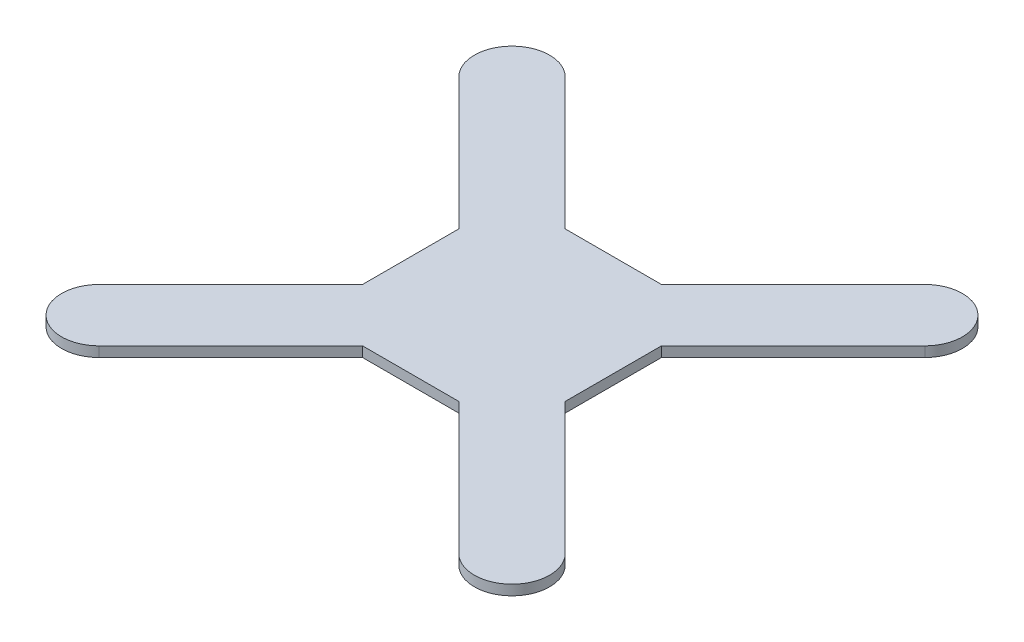
ISO-10303-21;
HEADER;
FILE_DESCRIPTION(('STEP AP214'),'2;1');
FILE_NAME('part.step','',(''),(''),'','','');
FILE_SCHEMA(('AUTOMOTIVE_DESIGN { 1 0 10303 214 1 1 1 1 }'));
ENDSEC;
DATA;
#1=APPLICATION_CONTEXT('core data for automotive mechanical design processes');
#2=APPLICATION_PROTOCOL_DEFINITION('international standard','automotive_design',2000,#1);
#3=PRODUCT_CONTEXT('',#1,'mechanical');
#4=PRODUCT('Part','Part','',(#3));
#5=PRODUCT_RELATED_PRODUCT_CATEGORY('part','',(#4));
#6=PRODUCT_DEFINITION_FORMATION('','',#4);
#7=PRODUCT_DEFINITION_CONTEXT('part definition',#1,'design');
#8=PRODUCT_DEFINITION('design','',#6,#7);
#9=PRODUCT_DEFINITION_SHAPE('','',#8);
#10=(LENGTH_UNIT() NAMED_UNIT(*) SI_UNIT(.MILLI.,.METRE.));
#11=(NAMED_UNIT(*) PLANE_ANGLE_UNIT() SI_UNIT($,.RADIAN.));
#12=(NAMED_UNIT(*) SI_UNIT($,.STERADIAN.) SOLID_ANGLE_UNIT());
#13=UNCERTAINTY_MEASURE_WITH_UNIT(LENGTH_MEASURE(1.E-05),#10,'distance_accuracy_value','');
#14=(GEOMETRIC_REPRESENTATION_CONTEXT(3) GLOBAL_UNCERTAINTY_ASSIGNED_CONTEXT((#13)) GLOBAL_UNIT_ASSIGNED_CONTEXT((#10,
#11,#12)) REPRESENTATION_CONTEXT('',''));
#15=CARTESIAN_POINT('',(0.,0.,0.));
#16=DIRECTION('',(0.,0.,1.));
#17=DIRECTION('',(1.,0.,0.));
#18=AXIS2_PLACEMENT_3D('',#15,#16,#17);
#19=CARTESIAN_POINT('',(330.,10.,0.));
#20=DIRECTION('',(1.,0.,0.));
#21=DIRECTION('',(0.,0.,-1.));
#22=AXIS2_PLACEMENT_3D('',#19,#20,#21);
#23=PLANE('',#22);
#24=DIRECTION('',(0.,0.,1.));
#25=VECTOR('',#24,1.);
#26=CARTESIAN_POINT('',(330.,0.,0.));
#27=LINE('',#26,#25);
#28=CARTESIAN_POINT('',(330.,0.,182.5));
#29=VERTEX_POINT('',#28);
#30=CARTESIAN_POINT('',(330.,0.,277.5));
#31=VERTEX_POINT('',#30);
#32=EDGE_CURVE('E178',#29,#31,#27,.T.);
#33=ORIENTED_EDGE('',*,*,#32,.F.);
#34=DIRECTION('',(0.,-1.,0.));
#35=VECTOR('',#34,1.);
#36=CARTESIAN_POINT('',(330.,10.,182.5));
#37=LINE('',#36,#35);
#38=CARTESIAN_POINT('',(330.,10.,182.5));
#39=VERTEX_POINT('',#38);
#40=EDGE_CURVE('E11',#39,#29,#37,.T.);
#41=ORIENTED_EDGE('',*,*,#40,.F.);
#42=DIRECTION('',(0.,0.,1.));
#43=VECTOR('',#42,1.);
#44=CARTESIAN_POINT('',(330.,10.,0.));
#45=LINE('',#44,#43);
#46=CARTESIAN_POINT('',(330.,10.,277.5));
#47=VERTEX_POINT('',#46);
#48=EDGE_CURVE('E217',#39,#47,#45,.T.);
#49=ORIENTED_EDGE('',*,*,#48,.T.);
#50=DIRECTION('',(0.,-1.,0.));
#51=VECTOR('',#50,1.);
#52=CARTESIAN_POINT('',(330.,10.,277.5));
#53=LINE('',#52,#51);
#54=EDGE_CURVE('E51',#47,#31,#53,.T.);
#55=ORIENTED_EDGE('',*,*,#54,.T.);
#56=EDGE_LOOP('',(#33,#41,#49,#55));
#57=FACE_BOUND('',#56,.T.);
#58=ADVANCED_FACE('F35',(#57),#23,.T.);
#59=CARTESIAN_POINT('',(256.250000000003,10.,256.249999999999));
#60=DIRECTION('',(-0.707106781186553,0.,-0.707106781186542));
#61=DIRECTION('',(-0.707106781186542,0.,0.707106781186553));
#62=AXIS2_PLACEMENT_3D('',#59,#60,#61);
#63=PLANE('',#62);
#64=DIRECTION('',(0.707106781186542,0.,-0.707106781186553));
#65=VECTOR('',#64,1.);
#66=CARTESIAN_POINT('',(256.250000000003,0.,256.249999999999));
#67=LINE('',#66,#65);
#68=CARTESIAN_POINT('',(459.999999999999,0.,52.4999999999988));
#69=VERTEX_POINT('',#68);
#70=EDGE_CURVE('E180',#29,#69,#67,.T.);
#71=ORIENTED_EDGE('',*,*,#70,.T.);
#72=DIRECTION('',(0.,-1.,0.));
#73=VECTOR('',#72,1.);
#74=CARTESIAN_POINT('',(459.999999999999,10.,52.4999999999988));
#75=LINE('',#74,#73);
#76=CARTESIAN_POINT('',(459.999999999999,10.,52.4999999999988));
#77=VERTEX_POINT('',#76);
#78=EDGE_CURVE('E43',#77,#69,#75,.T.);
#79=ORIENTED_EDGE('',*,*,#78,.F.);
#80=DIRECTION('',(0.707106781186542,0.,-0.707106781186553));
#81=VECTOR('',#80,1.);
#82=CARTESIAN_POINT('',(256.250000000003,10.,256.249999999999));
#83=LINE('',#82,#81);
#84=EDGE_CURVE('E269',#39,#77,#83,.T.);
#85=ORIENTED_EDGE('',*,*,#84,.F.);
#86=ORIENTED_EDGE('',*,*,#40,.T.);
#87=EDGE_LOOP('',(#71,#79,#85,#86));
#88=FACE_BOUND('',#87,.T.);
#89=ADVANCED_FACE('F310',(#88),#63,.F.);
#90=CARTESIAN_POINT('',(433.75,10.,26.2499999999991));
#91=DIRECTION('',(0.,-1.,0.));
#92=DIRECTION('',(0.,0.,-1.));
#93=AXIS2_PLACEMENT_3D('',#90,#91,#92);
#94=CYLINDRICAL_SURFACE('',#93,37.1231060122933);
#95=CARTESIAN_POINT('',(433.75,0.,26.2499999999991));
#96=DIRECTION('',(0.,1.,0.));
#97=DIRECTION('',(0.,0.,1.));
#98=AXIS2_PLACEMENT_3D('',#95,#96,#97);
#99=CIRCLE('',#98,37.1231060122933);
#100=CARTESIAN_POINT('',(407.5,0.,-3.33066907387547E-13));
#101=VERTEX_POINT('',#100);
#102=EDGE_CURVE('E182',#69,#101,#99,.T.);
#103=ORIENTED_EDGE('',*,*,#102,.T.);
#104=DIRECTION('',(0.,-1.,0.));
#105=VECTOR('',#104,1.);
#106=CARTESIAN_POINT('',(407.5,10.,-3.33066907387547E-13));
#107=LINE('',#106,#105);
#108=CARTESIAN_POINT('',(407.5,10.,-3.33066907387547E-13));
#109=VERTEX_POINT('',#108);
#110=EDGE_CURVE('E242',#109,#101,#107,.T.);
#111=ORIENTED_EDGE('',*,*,#110,.F.);
#112=CARTESIAN_POINT('',(433.75,10.,26.2499999999991));
#113=DIRECTION('',(0.,1.,0.));
#114=DIRECTION('',(0.,0.,1.));
#115=AXIS2_PLACEMENT_3D('',#112,#113,#114);
#116=CIRCLE('',#115,37.1231060122933);
#117=EDGE_CURVE('E250',#77,#109,#116,.T.);
#118=ORIENTED_EDGE('',*,*,#117,.F.);
#119=ORIENTED_EDGE('',*,*,#78,.T.);
#120=EDGE_LOOP('',(#103,#111,#118,#119));
#121=FACE_BOUND('',#120,.T.);
#122=ADVANCED_FACE('F248',(#121),#94,.T.);
#123=CARTESIAN_POINT('',(203.750000000001,10.,203.75));
#124=DIRECTION('',(-0.707106781186549,0.,-0.707106781186546));
#125=DIRECTION('',(-0.707106781186546,0.,0.707106781186549));
#126=AXIS2_PLACEMENT_3D('',#123,#124,#125);
#127=PLANE('',#126);
#128=DIRECTION('',(0.707106781186546,0.,-0.707106781186549));
#129=VECTOR('',#128,1.);
#130=CARTESIAN_POINT('',(203.750000000001,0.,203.75));
#131=LINE('',#130,#129);
#132=CARTESIAN_POINT('',(277.5,0.,130.));
#133=VERTEX_POINT('',#132);
#134=EDGE_CURVE('E185',#133,#101,#131,.T.);
#135=ORIENTED_EDGE('',*,*,#134,.F.);
#136=DIRECTION('',(0.,-1.,0.));
#137=VECTOR('',#136,1.);
#138=CARTESIAN_POINT('',(277.5,10.,130.));
#139=LINE('',#138,#137);
#140=CARTESIAN_POINT('',(277.5,10.,130.));
#141=VERTEX_POINT('',#140);
#142=EDGE_CURVE('E240',#141,#133,#139,.T.);
#143=ORIENTED_EDGE('',*,*,#142,.F.);
#144=DIRECTION('',(0.707106781186546,0.,-0.707106781186549));
#145=VECTOR('',#144,1.);
#146=CARTESIAN_POINT('',(203.750000000001,10.,203.75));
#147=LINE('',#146,#145);
#148=EDGE_CURVE('E262',#141,#109,#147,.T.);
#149=ORIENTED_EDGE('',*,*,#148,.T.);
#150=ORIENTED_EDGE('',*,*,#110,.T.);
#151=EDGE_LOOP('',(#135,#143,#149,#150));
#152=FACE_BOUND('',#151,.T.);
#153=ADVANCED_FACE('F259',(#152),#127,.T.);
#154=CARTESIAN_POINT('',(0.,10.,130.));
#155=DIRECTION('',(0.,0.,-1.));
#156=DIRECTION('',(-1.,0.,0.));
#157=AXIS2_PLACEMENT_3D('',#154,#155,#156);
#158=PLANE('',#157);
#159=DIRECTION('',(1.,0.,0.));
#160=VECTOR('',#159,1.);
#161=CARTESIAN_POINT('',(0.,0.,130.));
#162=LINE('',#161,#160);
#163=CARTESIAN_POINT('',(182.5,0.,130.));
#164=VERTEX_POINT('',#163);
#165=EDGE_CURVE('E188',#164,#133,#162,.T.);
#166=ORIENTED_EDGE('',*,*,#165,.F.);
#167=DIRECTION('',(0.,-1.,0.));
#168=VECTOR('',#167,1.);
#169=CARTESIAN_POINT('',(182.5,10.,130.));
#170=LINE('',#169,#168);
#171=CARTESIAN_POINT('',(182.5,10.,130.));
#172=VERTEX_POINT('',#171);
#173=EDGE_CURVE('E238',#172,#164,#170,.T.);
#174=ORIENTED_EDGE('',*,*,#173,.F.);
#175=DIRECTION('',(1.,0.,0.));
#176=VECTOR('',#175,1.);
#177=CARTESIAN_POINT('',(0.,10.,130.));
#178=LINE('',#177,#176);
#179=EDGE_CURVE('E265',#172,#141,#178,.T.);
#180=ORIENTED_EDGE('',*,*,#179,.T.);
#181=ORIENTED_EDGE('',*,*,#142,.T.);
#182=EDGE_LOOP('',(#166,#174,#180,#181));
#183=FACE_BOUND('',#182,.T.);
#184=ADVANCED_FACE('F422',(#183),#158,.T.);
#185=CARTESIAN_POINT('',(26.2500000000004,10.,-26.2500000000003));
#186=DIRECTION('',(-0.707106781186549,0.,0.707106781186546));
#187=DIRECTION('',(0.707106781186546,0.,0.707106781186549));
#188=AXIS2_PLACEMENT_3D('',#185,#186,#187);
#189=PLANE('',#188);
#190=DIRECTION('',(-0.707106781186546,0.,-0.707106781186549));
#191=VECTOR('',#190,1.);
#192=CARTESIAN_POINT('',(26.2500000000004,0.,-26.2500000000003));
#193=LINE('',#192,#191);
#194=CARTESIAN_POINT('',(52.5000000000005,0.,0.));
#195=VERTEX_POINT('',#194);
#196=EDGE_CURVE('E191',#164,#195,#193,.T.);
#197=ORIENTED_EDGE('',*,*,#196,.T.);
#198=DIRECTION('',(0.,-1.,0.));
#199=VECTOR('',#198,1.);
#200=CARTESIAN_POINT('',(52.5000000000005,10.,0.));
#201=LINE('',#200,#199);
#202=CARTESIAN_POINT('',(52.5000000000005,10.,0.));
#203=VERTEX_POINT('',#202);
#204=EDGE_CURVE('E235',#203,#195,#201,.T.);
#205=ORIENTED_EDGE('',*,*,#204,.F.);
#206=DIRECTION('',(-0.707106781186546,0.,-0.707106781186549));
#207=VECTOR('',#206,1.);
#208=CARTESIAN_POINT('',(26.2500000000004,10.,-26.2500000000003));
#209=LINE('',#208,#207);
#210=EDGE_CURVE('E267',#172,#203,#209,.T.);
#211=ORIENTED_EDGE('',*,*,#210,.F.);
#212=ORIENTED_EDGE('',*,*,#173,.T.);
#213=EDGE_LOOP('',(#197,#205,#211,#212));
#214=FACE_BOUND('',#213,.T.);
#215=ADVANCED_FACE('F412',(#214),#189,.F.);
#216=CARTESIAN_POINT('',(26.2500000000003,10.,26.2499999999993));
#217=DIRECTION('',(0.,-1.,0.));
#218=DIRECTION('',(0.,0.,-1.));
#219=AXIS2_PLACEMENT_3D('',#216,#217,#218);
#220=CYLINDRICAL_SURFACE('',#219,37.1231060122935);
#221=CARTESIAN_POINT('',(26.2500000000003,0.,26.2499999999993));
#222=DIRECTION('',(0.,1.,0.));
#223=DIRECTION('',(0.,0.,1.));
#224=AXIS2_PLACEMENT_3D('',#221,#222,#223);
#225=CIRCLE('',#224,37.1231060122935);
#226=CARTESIAN_POINT('',(0.,0.,52.4999999999986));
#227=VERTEX_POINT('',#226);
#228=EDGE_CURVE('E193',#195,#227,#225,.T.);
#229=ORIENTED_EDGE('',*,*,#228,.T.);
#230=DIRECTION('',(0.,-1.,0.));
#231=VECTOR('',#230,1.);
#232=CARTESIAN_POINT('',(0.,10.,52.4999999999986));
#233=LINE('',#232,#231);
#234=CARTESIAN_POINT('',(0.,10.,52.4999999999986));
#235=VERTEX_POINT('',#234);
#236=EDGE_CURVE('E233',#235,#227,#233,.T.);
#237=ORIENTED_EDGE('',*,*,#236,.F.);
#238=CARTESIAN_POINT('',(26.2500000000003,10.,26.2499999999993));
#239=DIRECTION('',(0.,1.,0.));
#240=DIRECTION('',(0.,0.,1.));
#241=AXIS2_PLACEMENT_3D('',#238,#239,#240);
#242=CIRCLE('',#241,37.1231060122935);
#243=EDGE_CURVE('E274',#203,#235,#242,.T.);
#244=ORIENTED_EDGE('',*,*,#243,.F.);
#245=ORIENTED_EDGE('',*,*,#204,.T.);
#246=EDGE_LOOP('',(#229,#237,#244,#245));
#247=FACE_BOUND('',#246,.T.);
#248=ADVANCED_FACE('F401',(#247),#220,.T.);
#249=CARTESIAN_POINT('',(-26.2499999999993,10.,26.249999999999));
#250=DIRECTION('',(-0.707106781186551,0.,0.707106781186544));
#251=DIRECTION('',(0.707106781186544,0.,0.707106781186551));
#252=AXIS2_PLACEMENT_3D('',#249,#250,#251);
#253=PLANE('',#252);
#254=DIRECTION('',(-0.707106781186544,0.,-0.707106781186551));
#255=VECTOR('',#254,1.);
#256=CARTESIAN_POINT('',(-26.2499999999993,0.,26.249999999999));
#257=LINE('',#256,#255);
#258=CARTESIAN_POINT('',(130.,0.,182.5));
#259=VERTEX_POINT('',#258);
#260=EDGE_CURVE('E196',#259,#227,#257,.T.);
#261=ORIENTED_EDGE('',*,*,#260,.F.);
#262=DIRECTION('',(0.,-1.,0.));
#263=VECTOR('',#262,1.);
#264=CARTESIAN_POINT('',(130.,10.,182.5));
#265=LINE('',#264,#263);
#266=CARTESIAN_POINT('',(130.,10.,182.5));
#267=VERTEX_POINT('',#266);
#268=EDGE_CURVE('E231',#267,#259,#265,.T.);
#269=ORIENTED_EDGE('',*,*,#268,.F.);
#270=DIRECTION('',(-0.707106781186544,0.,-0.707106781186551));
#271=VECTOR('',#270,1.);
#272=CARTESIAN_POINT('',(-26.2499999999993,10.,26.249999999999));
#273=LINE('',#272,#271);
#274=EDGE_CURVE('E276',#267,#235,#273,.T.);
#275=ORIENTED_EDGE('',*,*,#274,.T.);
#276=ORIENTED_EDGE('',*,*,#236,.T.);
#277=EDGE_LOOP('',(#261,#269,#275,#276));
#278=FACE_BOUND('',#277,.T.);
#279=ADVANCED_FACE('F390',(#278),#253,.T.);
#280=CARTESIAN_POINT('',(130.,10.,0.));
#281=DIRECTION('',(1.,0.,0.));
#282=DIRECTION('',(0.,0.,-1.));
#283=AXIS2_PLACEMENT_3D('',#280,#281,#282);
#284=PLANE('',#283);
#285=DIRECTION('',(0.,0.,1.));
#286=VECTOR('',#285,1.);
#287=CARTESIAN_POINT('',(130.,0.,0.));
#288=LINE('',#287,#286);
#289=CARTESIAN_POINT('',(130.,0.,277.5));
#290=VERTEX_POINT('',#289);
#291=EDGE_CURVE('E199',#259,#290,#288,.T.);
#292=ORIENTED_EDGE('',*,*,#291,.T.);
#293=DIRECTION('',(0.,-1.,0.));
#294=VECTOR('',#293,1.);
#295=CARTESIAN_POINT('',(130.,10.,277.5));
#296=LINE('',#295,#294);
#297=CARTESIAN_POINT('',(130.,10.,277.5));
#298=VERTEX_POINT('',#297);
#299=EDGE_CURVE('E228',#298,#290,#296,.T.);
#300=ORIENTED_EDGE('',*,*,#299,.F.);
#301=DIRECTION('',(0.,0.,1.));
#302=VECTOR('',#301,1.);
#303=CARTESIAN_POINT('',(130.,10.,0.));
#304=LINE('',#303,#302);
#305=EDGE_CURVE('E279',#267,#298,#304,.T.);
#306=ORIENTED_EDGE('',*,*,#305,.F.);
#307=ORIENTED_EDGE('',*,*,#268,.T.);
#308=EDGE_LOOP('',(#292,#300,#306,#307));
#309=FACE_BOUND('',#308,.T.);
#310=ADVANCED_FACE('F380',(#309),#284,.F.);
#311=CARTESIAN_POINT('',(203.750000000001,10.,203.749999999999));
#312=DIRECTION('',(0.707106781186551,0.,0.707106781186544));
#313=DIRECTION('',(0.707106781186544,0.,-0.707106781186551));
#314=AXIS2_PLACEMENT_3D('',#311,#312,#313);
#315=PLANE('',#314);
#316=DIRECTION('',(-0.707106781186544,0.,0.707106781186551));
#317=VECTOR('',#316,1.);
#318=CARTESIAN_POINT('',(203.750000000001,0.,203.749999999999));
#319=LINE('',#318,#317);
#320=CARTESIAN_POINT('',(1.11022302462516E-13,0.,407.500000000001));
#321=VERTEX_POINT('',#320);
#322=EDGE_CURVE('E201',#290,#321,#319,.T.);
#323=ORIENTED_EDGE('',*,*,#322,.T.);
#324=DIRECTION('',(0.,-1.,0.));
#325=VECTOR('',#324,1.);
#326=CARTESIAN_POINT('',(1.11022302462516E-13,10.,407.500000000001));
#327=LINE('',#326,#325);
#328=CARTESIAN_POINT('',(1.11022302462516E-13,10.,407.500000000001));
#329=VERTEX_POINT('',#328);
#330=EDGE_CURVE('E225',#329,#321,#327,.T.);
#331=ORIENTED_EDGE('',*,*,#330,.F.);
#332=DIRECTION('',(-0.707106781186544,0.,0.707106781186551));
#333=VECTOR('',#332,1.);
#334=CARTESIAN_POINT('',(203.750000000001,10.,203.749999999999));
#335=LINE('',#334,#333);
#336=EDGE_CURVE('E281',#298,#329,#335,.T.);
#337=ORIENTED_EDGE('',*,*,#336,.F.);
#338=ORIENTED_EDGE('',*,*,#299,.T.);
#339=EDGE_LOOP('',(#323,#331,#337,#338));
#340=FACE_BOUND('',#339,.T.);
#341=ADVANCED_FACE('F371',(#340),#315,.F.);
#342=CARTESIAN_POINT('',(26.2500000000003,10.,433.750000000001));
#343=DIRECTION('',(0.,-1.,0.));
#344=DIRECTION('',(0.,0.,-1.));
#345=AXIS2_PLACEMENT_3D('',#342,#343,#344);
#346=CYLINDRICAL_SURFACE('',#345,37.1231060122935);
#347=CARTESIAN_POINT('',(26.2500000000003,0.,433.750000000001));
#348=DIRECTION('',(0.,1.,0.));
#349=DIRECTION('',(0.,0.,1.));
#350=AXIS2_PLACEMENT_3D('',#347,#348,#349);
#351=CIRCLE('',#350,37.1231060122935);
#352=CARTESIAN_POINT('',(52.5000000000007,0.,460.));
#353=VERTEX_POINT('',#352);
#354=EDGE_CURVE('E203',#321,#353,#351,.T.);
#355=ORIENTED_EDGE('',*,*,#354,.T.);
#356=DIRECTION('',(0.,-1.,0.));
#357=VECTOR('',#356,1.);
#358=CARTESIAN_POINT('',(52.5000000000007,10.,460.));
#359=LINE('',#358,#357);
#360=CARTESIAN_POINT('',(52.5000000000007,10.,460.));
#361=VERTEX_POINT('',#360);
#362=EDGE_CURVE('E223',#361,#353,#359,.T.);
#363=ORIENTED_EDGE('',*,*,#362,.F.);
#364=CARTESIAN_POINT('',(26.2500000000003,10.,433.750000000001));
#365=DIRECTION('',(0.,1.,0.));
#366=DIRECTION('',(0.,0.,1.));
#367=AXIS2_PLACEMENT_3D('',#364,#365,#366);
#368=CIRCLE('',#367,37.1231060122935);
#369=EDGE_CURVE('E283',#329,#361,#368,.T.);
#370=ORIENTED_EDGE('',*,*,#369,.F.);
#371=ORIENTED_EDGE('',*,*,#330,.T.);
#372=EDGE_LOOP('',(#355,#363,#370,#371));
#373=FACE_BOUND('',#372,.T.);
#374=ADVANCED_FACE('F295',(#373),#346,.T.);
#375=CARTESIAN_POINT('',(256.25,10.,256.249999999999));
#376=DIRECTION('',(0.707106781186549,0.,0.707106781186546));
#377=DIRECTION('',(0.707106781186546,0.,-0.707106781186549));
#378=AXIS2_PLACEMENT_3D('',#375,#376,#377);
#379=PLANE('',#378);
#380=DIRECTION('',(-0.707106781186546,0.,0.707106781186549));
#381=VECTOR('',#380,1.);
#382=CARTESIAN_POINT('',(256.25,0.,256.249999999999));
#383=LINE('',#382,#381);
#384=CARTESIAN_POINT('',(182.5,0.,330.));
#385=VERTEX_POINT('',#384);
#386=EDGE_CURVE('E206',#385,#353,#383,.T.);
#387=ORIENTED_EDGE('',*,*,#386,.F.);
#388=DIRECTION('',(0.,-1.,0.));
#389=VECTOR('',#388,1.);
#390=CARTESIAN_POINT('',(182.5,10.,330.));
#391=LINE('',#390,#389);
#392=CARTESIAN_POINT('',(182.5,10.,330.));
#393=VERTEX_POINT('',#392);
#394=EDGE_CURVE('E221',#393,#385,#391,.T.);
#395=ORIENTED_EDGE('',*,*,#394,.F.);
#396=DIRECTION('',(-0.707106781186546,0.,0.707106781186549));
#397=VECTOR('',#396,1.);
#398=CARTESIAN_POINT('',(256.25,10.,256.249999999999));
#399=LINE('',#398,#397);
#400=EDGE_CURVE('E285',#393,#361,#399,.T.);
#401=ORIENTED_EDGE('',*,*,#400,.T.);
#402=ORIENTED_EDGE('',*,*,#362,.T.);
#403=EDGE_LOOP('',(#387,#395,#401,#402));
#404=FACE_BOUND('',#403,.T.);
#405=ADVANCED_FACE('F289',(#404),#379,.T.);
#406=CARTESIAN_POINT('',(0.,10.,330.));
#407=DIRECTION('',(0.,0.,-1.));
#408=DIRECTION('',(-1.,0.,0.));
#409=AXIS2_PLACEMENT_3D('',#406,#407,#408);
#410=PLANE('',#409);
#411=DIRECTION('',(1.,0.,0.));
#412=VECTOR('',#411,1.);
#413=CARTESIAN_POINT('',(0.,0.,330.));
#414=LINE('',#413,#412);
#415=CARTESIAN_POINT('',(277.5,0.,330.));
#416=VERTEX_POINT('',#415);
#417=EDGE_CURVE('E209',#385,#416,#414,.T.);
#418=ORIENTED_EDGE('',*,*,#417,.T.);
#419=DIRECTION('',(0.,-1.,0.));
#420=VECTOR('',#419,1.);
#421=CARTESIAN_POINT('',(277.5,10.,330.));
#422=LINE('',#421,#420);
#423=CARTESIAN_POINT('',(277.5,10.,330.));
#424=VERTEX_POINT('',#423);
#425=EDGE_CURVE('E170',#424,#416,#422,.T.);
#426=ORIENTED_EDGE('',*,*,#425,.F.);
#427=DIRECTION('',(1.,0.,0.));
#428=VECTOR('',#427,1.);
#429=CARTESIAN_POINT('',(0.,10.,330.));
#430=LINE('',#429,#428);
#431=EDGE_CURVE('E158',#393,#424,#430,.T.);
#432=ORIENTED_EDGE('',*,*,#431,.F.);
#433=ORIENTED_EDGE('',*,*,#394,.T.);
#434=EDGE_LOOP('',(#418,#426,#432,#433));
#435=FACE_BOUND('',#434,.T.);
#436=ADVANCED_FACE('F300',(#435),#410,.F.);
#437=CARTESIAN_POINT('',(-26.2499999999994,10.,26.2499999999993));
#438=DIRECTION('',(0.707106781186549,0.,-0.707106781186546));
#439=DIRECTION('',(-0.707106781186546,0.,-0.707106781186549));
#440=AXIS2_PLACEMENT_3D('',#437,#438,#439);
#441=PLANE('',#440);
#442=DIRECTION('',(0.707106781186546,0.,0.707106781186549));
#443=VECTOR('',#442,1.);
#444=CARTESIAN_POINT('',(-26.2499999999994,0.,26.2499999999993));
#445=LINE('',#444,#443);
#446=CARTESIAN_POINT('',(407.499999999999,0.,460.));
#447=VERTEX_POINT('',#446);
#448=EDGE_CURVE('E167',#416,#447,#445,.T.);
#449=ORIENTED_EDGE('',*,*,#448,.T.);
#450=DIRECTION('',(0.,-1.,0.));
#451=VECTOR('',#450,1.);
#452=CARTESIAN_POINT('',(407.499999999999,10.,460.));
#453=LINE('',#452,#451);
#454=CARTESIAN_POINT('',(407.499999999999,10.,460.));
#455=VERTEX_POINT('',#454);
#456=EDGE_CURVE('E164',#455,#447,#453,.T.);
#457=ORIENTED_EDGE('',*,*,#456,.F.);
#458=DIRECTION('',(0.707106781186546,0.,0.707106781186549));
#459=VECTOR('',#458,1.);
#460=CARTESIAN_POINT('',(-26.2499999999994,10.,26.2499999999993));
#461=LINE('',#460,#459);
#462=EDGE_CURVE('E149',#424,#455,#461,.T.);
#463=ORIENTED_EDGE('',*,*,#462,.F.);
#464=ORIENTED_EDGE('',*,*,#425,.T.);
#465=EDGE_LOOP('',(#449,#457,#463,#464));
#466=FACE_BOUND('',#465,.T.);
#467=ADVANCED_FACE('F165',(#466),#441,.F.);
#468=CARTESIAN_POINT('',(433.75,10.,433.750000000001));
#469=DIRECTION('',(0.,-1.,0.));
#470=DIRECTION('',(0.,0.,-1.));
#471=AXIS2_PLACEMENT_3D('',#468,#469,#470);
#472=CYLINDRICAL_SURFACE('',#471,37.1231060122935);
#473=CARTESIAN_POINT('',(433.75,0.,433.750000000001));
#474=DIRECTION('',(0.,1.,0.));
#475=DIRECTION('',(0.,0.,1.));
#476=AXIS2_PLACEMENT_3D('',#473,#474,#475);
#477=CIRCLE('',#476,37.1231060122935);
#478=CARTESIAN_POINT('',(460.,0.,407.500000000001));
#479=VERTEX_POINT('',#478);
#480=EDGE_CURVE('E212',#447,#479,#477,.T.);
#481=ORIENTED_EDGE('',*,*,#480,.T.);
#482=DIRECTION('',(0.,-1.,0.));
#483=VECTOR('',#482,1.);
#484=CARTESIAN_POINT('',(460.,10.,407.500000000001));
#485=LINE('',#484,#483);
#486=CARTESIAN_POINT('',(460.,10.,407.500000000001));
#487=VERTEX_POINT('',#486);
#488=EDGE_CURVE('E101',#487,#479,#485,.T.);
#489=ORIENTED_EDGE('',*,*,#488,.F.);
#490=CARTESIAN_POINT('',(433.75,10.,433.750000000001));
#491=DIRECTION('',(0.,1.,0.));
#492=DIRECTION('',(0.,0.,1.));
#493=AXIS2_PLACEMENT_3D('',#490,#491,#492);
#494=CIRCLE('',#493,37.1231060122935);
#495=EDGE_CURVE('E155',#455,#487,#494,.T.);
#496=ORIENTED_EDGE('',*,*,#495,.F.);
#497=ORIENTED_EDGE('',*,*,#456,.T.);
#498=EDGE_LOOP('',(#481,#489,#496,#497));
#499=FACE_BOUND('',#498,.T.);
#500=ADVANCED_FACE('F172',(#499),#472,.T.);
#501=CARTESIAN_POINT('',(26.2500000000016,10.,-26.2500000000014));
#502=DIRECTION('',(0.707106781186551,0.,-0.707106781186544));
#503=DIRECTION('',(-0.707106781186544,0.,-0.707106781186551));
#504=AXIS2_PLACEMENT_3D('',#501,#502,#503);
#505=PLANE('',#504);
#506=DIRECTION('',(0.707106781186544,0.,0.707106781186551));
#507=VECTOR('',#506,1.);
#508=CARTESIAN_POINT('',(26.2500000000016,0.,-26.2500000000014));
#509=LINE('',#508,#507);
#510=EDGE_CURVE('E214',#31,#479,#509,.T.);
#511=ORIENTED_EDGE('',*,*,#510,.F.);
#512=ORIENTED_EDGE('',*,*,#54,.F.);
#513=DIRECTION('',(0.707106781186544,0.,0.707106781186551));
#514=VECTOR('',#513,1.);
#515=CARTESIAN_POINT('',(26.2500000000016,10.,-26.2500000000014));
#516=LINE('',#515,#514);
#517=EDGE_CURVE('E173',#47,#487,#516,.T.);
#518=ORIENTED_EDGE('',*,*,#517,.T.);
#519=ORIENTED_EDGE('',*,*,#488,.T.);
#520=EDGE_LOOP('',(#511,#512,#518,#519));
#521=FACE_BOUND('',#520,.T.);
#522=ADVANCED_FACE('F314',(#521),#505,.T.);
#523=CARTESIAN_POINT('',(0.,10.,0.));
#524=DIRECTION('',(0.,1.,0.));
#525=DIRECTION('',(0.,0.,1.));
#526=AXIS2_PLACEMENT_3D('',#523,#524,#525);
#527=PLANE('',#526);
#528=ORIENTED_EDGE('',*,*,#48,.F.);
#529=ORIENTED_EDGE('',*,*,#84,.T.);
#530=ORIENTED_EDGE('',*,*,#117,.T.);
#531=ORIENTED_EDGE('',*,*,#148,.F.);
#532=ORIENTED_EDGE('',*,*,#179,.F.);
#533=ORIENTED_EDGE('',*,*,#210,.T.);
#534=ORIENTED_EDGE('',*,*,#243,.T.);
#535=ORIENTED_EDGE('',*,*,#274,.F.);
#536=ORIENTED_EDGE('',*,*,#305,.T.);
#537=ORIENTED_EDGE('',*,*,#336,.T.);
#538=ORIENTED_EDGE('',*,*,#369,.T.);
#539=ORIENTED_EDGE('',*,*,#400,.F.);
#540=ORIENTED_EDGE('',*,*,#431,.T.);
#541=ORIENTED_EDGE('',*,*,#462,.T.);
#542=ORIENTED_EDGE('',*,*,#495,.T.);
#543=ORIENTED_EDGE('',*,*,#517,.F.);
#544=EDGE_LOOP('',(#528,#529,#530,#531,#532,#533,#534,#535,#536,#537,#538,#539,#540,#541,#542,#543));
#545=FACE_BOUND('',#544,.T.);
#546=ADVANCED_FACE('F152',(#545),#527,.T.);
#547=CARTESIAN_POINT('',(0.,0.,0.));
#548=DIRECTION('',(0.,1.,0.));
#549=DIRECTION('',(0.,0.,1.));
#550=AXIS2_PLACEMENT_3D('',#547,#548,#549);
#551=PLANE('',#550);
#552=ORIENTED_EDGE('',*,*,#32,.T.);
#553=ORIENTED_EDGE('',*,*,#510,.T.);
#554=ORIENTED_EDGE('',*,*,#480,.F.);
#555=ORIENTED_EDGE('',*,*,#448,.F.);
#556=ORIENTED_EDGE('',*,*,#417,.F.);
#557=ORIENTED_EDGE('',*,*,#386,.T.);
#558=ORIENTED_EDGE('',*,*,#354,.F.);
#559=ORIENTED_EDGE('',*,*,#322,.F.);
#560=ORIENTED_EDGE('',*,*,#291,.F.);
#561=ORIENTED_EDGE('',*,*,#260,.T.);
#562=ORIENTED_EDGE('',*,*,#228,.F.);
#563=ORIENTED_EDGE('',*,*,#196,.F.);
#564=ORIENTED_EDGE('',*,*,#165,.T.);
#565=ORIENTED_EDGE('',*,*,#134,.T.);
#566=ORIENTED_EDGE('',*,*,#102,.F.);
#567=ORIENTED_EDGE('',*,*,#70,.F.);
#568=EDGE_LOOP('',(#552,#553,#554,#555,#556,#557,#558,#559,#560,#561,#562,#563,#564,#565,#566,#567));
#569=FACE_BOUND('',#568,.T.);
#570=ADVANCED_FACE('F254',(#569),#551,.F.);
#571=CLOSED_SHELL('',(#58,#89,#122,#153,#184,#215,#248,#279,#310,#341,#374,#405,#436,#467,#500,
#522,#546,#570));
#572=MANIFOLD_SOLID_BREP('B2',#571);
#573=ADVANCED_BREP_SHAPE_REPRESENTATION('',(#18,#572),#14);
#574=SHAPE_DEFINITION_REPRESENTATION(#9,#573);
ENDSEC;
END-ISO-10303-21;
